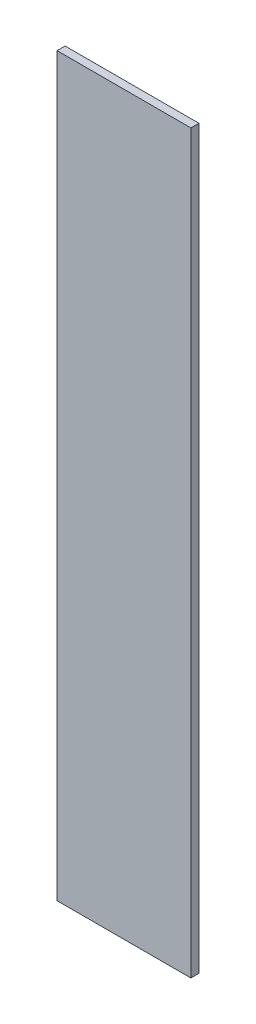
ISO-10303-21;
HEADER;
FILE_DESCRIPTION(('STEP AP214'),'2;1');
FILE_NAME('part.step','',(''),(''),'','','');
FILE_SCHEMA(('AUTOMOTIVE_DESIGN { 1 0 10303 214 1 1 1 1 }'));
ENDSEC;
DATA;
#1=APPLICATION_CONTEXT('core data for automotive mechanical design processes');
#2=APPLICATION_PROTOCOL_DEFINITION('international standard','automotive_design',2000,#1);
#3=PRODUCT_CONTEXT('',#1,'mechanical');
#4=PRODUCT('Part','Part','',(#3));
#5=PRODUCT_RELATED_PRODUCT_CATEGORY('part','',(#4));
#6=PRODUCT_DEFINITION_FORMATION('','',#4);
#7=PRODUCT_DEFINITION_CONTEXT('part definition',#1,'design');
#8=PRODUCT_DEFINITION('design','',#6,#7);
#9=PRODUCT_DEFINITION_SHAPE('','',#8);
#10=(LENGTH_UNIT() NAMED_UNIT(*) SI_UNIT(.MILLI.,.METRE.));
#11=(NAMED_UNIT(*) PLANE_ANGLE_UNIT() SI_UNIT($,.RADIAN.));
#12=(NAMED_UNIT(*) SI_UNIT($,.STERADIAN.) SOLID_ANGLE_UNIT());
#13=UNCERTAINTY_MEASURE_WITH_UNIT(LENGTH_MEASURE(1.E-05),#10,'distance_accuracy_value','');
#14=(GEOMETRIC_REPRESENTATION_CONTEXT(3) GLOBAL_UNCERTAINTY_ASSIGNED_CONTEXT((#13)) GLOBAL_UNIT_ASSIGNED_CONTEXT((#10,
#11,#12)) REPRESENTATION_CONTEXT('',''));
#15=CARTESIAN_POINT('',(0.,0.,0.));
#16=DIRECTION('',(0.,0.,1.));
#17=DIRECTION('',(1.,0.,0.));
#18=AXIS2_PLACEMENT_3D('',#15,#16,#17);
#19=CARTESIAN_POINT('',(-22.8054034504419,65.6791907514451,3.));
#20=DIRECTION('',(1.,0.,0.));
#21=DIRECTION('',(0.,1.,0.));
#22=AXIS2_PLACEMENT_3D('',#19,#20,#21);
#23=PLANE('',#22);
#24=DIRECTION('',(0.,-1.,0.));
#25=VECTOR('',#24,1.);
#26=CARTESIAN_POINT('',(-22.8054034504419,65.6791907514451,0.));
#27=LINE('',#26,#25);
#28=CARTESIAN_POINT('',(-22.8054034504419,65.6791907514451,0.));
#29=VERTEX_POINT('',#28);
#30=CARTESIAN_POINT('',(-22.8054034504419,-209.320809248555,0.));
#31=VERTEX_POINT('',#30);
#32=EDGE_CURVE('E96',#29,#31,#27,.T.);
#33=ORIENTED_EDGE('',*,*,#32,.T.);
#34=DIRECTION('',(0.,0.,-1.));
#35=VECTOR('',#34,1.);
#36=CARTESIAN_POINT('',(-22.8054034504419,-209.320809248555,3.));
#37=LINE('',#36,#35);
#38=CARTESIAN_POINT('',(-22.8054034504419,-209.320809248555,3.));
#39=VERTEX_POINT('',#38);
#40=EDGE_CURVE('E11',#39,#31,#37,.T.);
#41=ORIENTED_EDGE('',*,*,#40,.F.);
#42=DIRECTION('',(0.,-1.,0.));
#43=VECTOR('',#42,1.);
#44=CARTESIAN_POINT('',(-22.8054034504419,65.6791907514451,3.));
#45=LINE('',#44,#43);
#46=CARTESIAN_POINT('',(-22.8054034504419,65.6791907514451,3.));
#47=VERTEX_POINT('',#46);
#48=EDGE_CURVE('E84',#47,#39,#45,.T.);
#49=ORIENTED_EDGE('',*,*,#48,.F.);
#50=DIRECTION('',(0.,0.,-1.));
#51=VECTOR('',#50,1.);
#52=CARTESIAN_POINT('',(-22.8054034504419,65.6791907514451,3.));
#53=LINE('',#52,#51);
#54=EDGE_CURVE('E92',#47,#29,#53,.T.);
#55=ORIENTED_EDGE('',*,*,#54,.T.);
#56=EDGE_LOOP('',(#33,#41,#49,#55));
#57=FACE_BOUND('',#56,.T.);
#58=ADVANCED_FACE('F33',(#57),#23,.F.);
#59=CARTESIAN_POINT('',(-22.8054034504419,-209.320809248555,3.));
#60=DIRECTION('',(0.,1.,0.));
#61=DIRECTION('',(0.,0.,1.));
#62=AXIS2_PLACEMENT_3D('',#59,#60,#61);
#63=PLANE('',#62);
#64=DIRECTION('',(1.,0.,0.));
#65=VECTOR('',#64,1.);
#66=CARTESIAN_POINT('',(-22.8054034504419,-209.320809248555,0.));
#67=LINE('',#66,#65);
#68=CARTESIAN_POINT('',(27.1945965495581,-209.320809248555,0.));
#69=VERTEX_POINT('',#68);
#70=EDGE_CURVE('E88',#31,#69,#67,.T.);
#71=ORIENTED_EDGE('',*,*,#70,.T.);
#72=DIRECTION('',(0.,0.,-1.));
#73=VECTOR('',#72,1.);
#74=CARTESIAN_POINT('',(27.1945965495581,-209.320809248555,3.));
#75=LINE('',#74,#73);
#76=CARTESIAN_POINT('',(27.1945965495581,-209.320809248555,3.));
#77=VERTEX_POINT('',#76);
#78=EDGE_CURVE('E41',#77,#69,#75,.T.);
#79=ORIENTED_EDGE('',*,*,#78,.F.);
#80=DIRECTION('',(1.,0.,0.));
#81=VECTOR('',#80,1.);
#82=CARTESIAN_POINT('',(-22.8054034504419,-209.320809248555,3.));
#83=LINE('',#82,#81);
#84=EDGE_CURVE('E79',#39,#77,#83,.T.);
#85=ORIENTED_EDGE('',*,*,#84,.F.);
#86=ORIENTED_EDGE('',*,*,#40,.T.);
#87=EDGE_LOOP('',(#71,#79,#85,#86));
#88=FACE_BOUND('',#87,.T.);
#89=ADVANCED_FACE('F87',(#88),#63,.F.);
#90=CARTESIAN_POINT('',(27.1945965495581,65.6791907514451,3.));
#91=DIRECTION('',(-1.,0.,0.));
#92=DIRECTION('',(0.,-1.,0.));
#93=AXIS2_PLACEMENT_3D('',#90,#91,#92);
#94=PLANE('',#93);
#95=DIRECTION('',(0.,1.,0.));
#96=VECTOR('',#95,1.);
#97=CARTESIAN_POINT('',(27.1945965495581,65.6791907514451,0.));
#98=LINE('',#97,#96);
#99=CARTESIAN_POINT('',(27.1945965495581,65.6791907514451,0.));
#100=VERTEX_POINT('',#99);
#101=EDGE_CURVE('E66',#69,#100,#98,.T.);
#102=ORIENTED_EDGE('',*,*,#101,.T.);
#103=DIRECTION('',(0.,0.,-1.));
#104=VECTOR('',#103,1.);
#105=CARTESIAN_POINT('',(27.1945965495581,65.6791907514451,3.));
#106=LINE('',#105,#104);
#107=CARTESIAN_POINT('',(27.1945965495581,65.6791907514451,3.));
#108=VERTEX_POINT('',#107);
#109=EDGE_CURVE('E89',#108,#100,#106,.T.);
#110=ORIENTED_EDGE('',*,*,#109,.F.);
#111=DIRECTION('',(0.,1.,0.));
#112=VECTOR('',#111,1.);
#113=CARTESIAN_POINT('',(27.1945965495581,65.6791907514451,3.));
#114=LINE('',#113,#112);
#115=EDGE_CURVE('E82',#77,#108,#114,.T.);
#116=ORIENTED_EDGE('',*,*,#115,.F.);
#117=ORIENTED_EDGE('',*,*,#78,.T.);
#118=EDGE_LOOP('',(#102,#110,#116,#117));
#119=FACE_BOUND('',#118,.T.);
#120=ADVANCED_FACE('F90',(#119),#94,.F.);
#121=CARTESIAN_POINT('',(-22.8054034504419,65.6791907514451,3.));
#122=DIRECTION('',(0.,-1.,0.));
#123=DIRECTION('',(0.,0.,-1.));
#124=AXIS2_PLACEMENT_3D('',#121,#122,#123);
#125=PLANE('',#124);
#126=DIRECTION('',(-1.,0.,0.));
#127=VECTOR('',#126,1.);
#128=CARTESIAN_POINT('',(-22.8054034504419,65.6791907514451,0.));
#129=LINE('',#128,#127);
#130=EDGE_CURVE('E72',#100,#29,#129,.T.);
#131=ORIENTED_EDGE('',*,*,#130,.T.);
#132=ORIENTED_EDGE('',*,*,#54,.F.);
#133=DIRECTION('',(-1.,0.,0.));
#134=VECTOR('',#133,1.);
#135=CARTESIAN_POINT('',(-22.8054034504419,65.6791907514451,3.));
#136=LINE('',#135,#134);
#137=EDGE_CURVE('E49',#108,#47,#136,.T.);
#138=ORIENTED_EDGE('',*,*,#137,.F.);
#139=ORIENTED_EDGE('',*,*,#109,.T.);
#140=EDGE_LOOP('',(#131,#132,#138,#139));
#141=FACE_BOUND('',#140,.T.);
#142=ADVANCED_FACE('F103',(#141),#125,.F.);
#143=CARTESIAN_POINT('',(0.,0.,3.));
#144=DIRECTION('',(0.,0.,1.));
#145=DIRECTION('',(1.,0.,0.));
#146=AXIS2_PLACEMENT_3D('',#143,#144,#145);
#147=PLANE('',#146);
#148=ORIENTED_EDGE('',*,*,#48,.T.);
#149=ORIENTED_EDGE('',*,*,#84,.T.);
#150=ORIENTED_EDGE('',*,*,#115,.T.);
#151=ORIENTED_EDGE('',*,*,#137,.T.);
#152=EDGE_LOOP('',(#148,#149,#150,#151));
#153=FACE_BOUND('',#152,.T.);
#154=ADVANCED_FACE('F80',(#153),#147,.T.);
#155=CARTESIAN_POINT('',(0.,0.,0.));
#156=DIRECTION('',(0.,0.,1.));
#157=DIRECTION('',(1.,0.,0.));
#158=AXIS2_PLACEMENT_3D('',#155,#156,#157);
#159=PLANE('',#158);
#160=ORIENTED_EDGE('',*,*,#32,.F.);
#161=ORIENTED_EDGE('',*,*,#130,.F.);
#162=ORIENTED_EDGE('',*,*,#101,.F.);
#163=ORIENTED_EDGE('',*,*,#70,.F.);
#164=EDGE_LOOP('',(#160,#161,#162,#163));
#165=FACE_BOUND('',#164,.T.);
#166=ADVANCED_FACE('F106',(#165),#159,.F.);
#167=CLOSED_SHELL('',(#58,#89,#120,#142,#154,#166));
#168=MANIFOLD_SOLID_BREP('B2',#167);
#169=ADVANCED_BREP_SHAPE_REPRESENTATION('',(#18,#168),#14);
#170=SHAPE_DEFINITION_REPRESENTATION(#9,#169);
ENDSEC;
END-ISO-10303-21;
